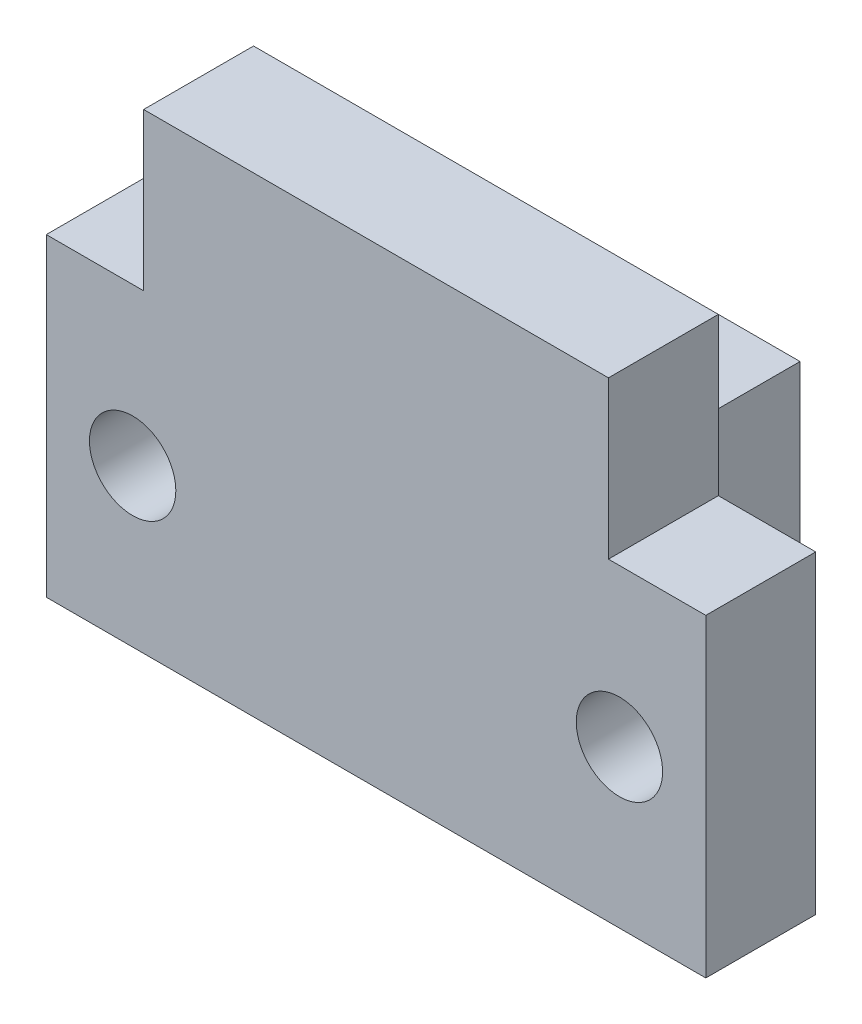
ISO-10303-21;
HEADER;
FILE_DESCRIPTION(('STEP AP214'),'2;1');
FILE_NAME('part.step','',(''),(''),'','','');
FILE_SCHEMA(('AUTOMOTIVE_DESIGN { 1 0 10303 214 1 1 1 1 }'));
ENDSEC;
DATA;
#1=APPLICATION_CONTEXT('core data for automotive mechanical design processes');
#2=APPLICATION_PROTOCOL_DEFINITION('international standard','automotive_design',2000,#1);
#3=PRODUCT_CONTEXT('',#1,'mechanical');
#4=PRODUCT('Part','Part','',(#3));
#5=PRODUCT_RELATED_PRODUCT_CATEGORY('part','',(#4));
#6=PRODUCT_DEFINITION_FORMATION('','',#4);
#7=PRODUCT_DEFINITION_CONTEXT('part definition',#1,'design');
#8=PRODUCT_DEFINITION('design','',#6,#7);
#9=PRODUCT_DEFINITION_SHAPE('','',#8);
#10=(LENGTH_UNIT() NAMED_UNIT(*) SI_UNIT(.MILLI.,.METRE.));
#11=(NAMED_UNIT(*) PLANE_ANGLE_UNIT() SI_UNIT($,.RADIAN.));
#12=(NAMED_UNIT(*) SI_UNIT($,.STERADIAN.) SOLID_ANGLE_UNIT());
#13=UNCERTAINTY_MEASURE_WITH_UNIT(LENGTH_MEASURE(1.E-05),#10,'distance_accuracy_value','');
#14=(GEOMETRIC_REPRESENTATION_CONTEXT(3) GLOBAL_UNCERTAINTY_ASSIGNED_CONTEXT((#13)) GLOBAL_UNIT_ASSIGNED_CONTEXT((#10,
#11,#12)) REPRESENTATION_CONTEXT('',''));
#15=CARTESIAN_POINT('',(0.,0.,0.));
#16=DIRECTION('',(0.,0.,1.));
#17=DIRECTION('',(1.,0.,0.));
#18=AXIS2_PLACEMENT_3D('',#15,#16,#17);
#19=CARTESIAN_POINT('',(0.,20.,0.));
#20=DIRECTION('',(0.,1.,0.));
#21=DIRECTION('',(0.,0.,1.));
#22=AXIS2_PLACEMENT_3D('',#19,#20,#21);
#23=PLANE('',#22);
#24=DIRECTION('',(-1.,0.,0.));
#25=VECTOR('',#24,1.);
#26=CARTESIAN_POINT('',(-14.8,20.,-3.5));
#27=LINE('',#26,#25);
#28=CARTESIAN_POINT('',(10.,20.,-3.5));
#29=VERTEX_POINT('',#28);
#30=CARTESIAN_POINT('',(4.,20.,-3.5));
#31=VERTEX_POINT('',#30);
#32=EDGE_CURVE('E15',#29,#31,#27,.T.);
#33=ORIENTED_EDGE('',*,*,#32,.F.);
#34=DIRECTION('',(0.,0.,-1.));
#35=VECTOR('',#34,1.);
#36=CARTESIAN_POINT('',(10.,20.,-3.49999999999999));
#37=LINE('',#36,#35);
#38=CARTESIAN_POINT('',(10.,20.,-13.5));
#39=VERTEX_POINT('',#38);
#40=EDGE_CURVE('E336',#29,#39,#37,.T.);
#41=ORIENTED_EDGE('',*,*,#40,.T.);
#42=DIRECTION('',(-1.,0.,0.));
#43=VECTOR('',#42,1.);
#44=CARTESIAN_POINT('',(10.,20.,-13.5));
#45=LINE('',#44,#43);
#46=CARTESIAN_POINT('',(4.,20.,-13.5));
#47=VERTEX_POINT('',#46);
#48=EDGE_CURVE('E333',#39,#47,#45,.T.);
#49=ORIENTED_EDGE('',*,*,#48,.T.);
#50=DIRECTION('',(0.,0.,-1.));
#51=VECTOR('',#50,1.);
#52=CARTESIAN_POINT('',(4.,20.,-3.49999999999999));
#53=LINE('',#52,#51);
#54=EDGE_CURVE('E330',#31,#47,#53,.T.);
#55=ORIENTED_EDGE('',*,*,#54,.F.);
#56=EDGE_LOOP('',(#33,#41,#49,#55));
#57=FACE_BOUND('',#56,.T.);
#58=ADVANCED_FACE('F88',(#57),#23,.T.);
#59=DIRECTION('',(-1.,0.,0.));
#60=VECTOR('',#59,1.);
#61=CARTESIAN_POINT('',(0.,20.,-3.5));
#62=LINE('',#61,#60);
#63=CARTESIAN_POINT('',(21.,20.,-3.5));
#64=VERTEX_POINT('',#63);
#65=CARTESIAN_POINT('',(14.8,20.,-3.5));
#66=VERTEX_POINT('',#65);
#67=EDGE_CURVE('E113',#64,#66,#62,.T.);
#68=ORIENTED_EDGE('',*,*,#67,.T.);
#69=DIRECTION('',(0.,0.,1.));
#70=VECTOR('',#69,1.);
#71=CARTESIAN_POINT('',(14.8,20.,-34.7435593362856));
#72=LINE('',#71,#70);
#73=CARTESIAN_POINT('',(14.8,20.,3.5));
#74=VERTEX_POINT('',#73);
#75=EDGE_CURVE('E218',#66,#74,#72,.T.);
#76=ORIENTED_EDGE('',*,*,#75,.T.);
#77=DIRECTION('',(-1.,0.,0.));
#78=VECTOR('',#77,1.);
#79=CARTESIAN_POINT('',(0.,20.,3.5));
#80=LINE('',#79,#78);
#81=CARTESIAN_POINT('',(21.,20.,3.5));
#82=VERTEX_POINT('',#81);
#83=EDGE_CURVE('E208',#82,#74,#80,.T.);
#84=ORIENTED_EDGE('',*,*,#83,.F.);
#85=DIRECTION('',(0.,0.,-1.));
#86=VECTOR('',#85,1.);
#87=CARTESIAN_POINT('',(21.,20.,0.));
#88=LINE('',#87,#86);
#89=EDGE_CURVE('E273',#82,#64,#88,.T.);
#90=ORIENTED_EDGE('',*,*,#89,.T.);
#91=EDGE_LOOP('',(#68,#76,#84,#90));
#92=FACE_BOUND('',#91,.T.);
#93=ADVANCED_FACE('F369',(#92),#23,.T.);
#94=CARTESIAN_POINT('',(-4.,20.,-3.5));
#95=VERTEX_POINT('',#94);
#96=CARTESIAN_POINT('',(-10.,20.,-3.5));
#97=VERTEX_POINT('',#96);
#98=EDGE_CURVE('E97',#95,#97,#27,.T.);
#99=ORIENTED_EDGE('',*,*,#98,.F.);
#100=DIRECTION('',(0.,0.,-1.));
#101=VECTOR('',#100,1.);
#102=CARTESIAN_POINT('',(-4.,20.,0.));
#103=LINE('',#102,#101);
#104=CARTESIAN_POINT('',(-4.,20.,-13.5));
#105=VERTEX_POINT('',#104);
#106=EDGE_CURVE('E276',#95,#105,#103,.T.);
#107=ORIENTED_EDGE('',*,*,#106,.T.);
#108=DIRECTION('',(1.,0.,0.));
#109=VECTOR('',#108,1.);
#110=CARTESIAN_POINT('',(0.,20.,-13.5));
#111=LINE('',#110,#109);
#112=CARTESIAN_POINT('',(-10.,20.,-13.5));
#113=VERTEX_POINT('',#112);
#114=EDGE_CURVE('E279',#113,#105,#111,.T.);
#115=ORIENTED_EDGE('',*,*,#114,.F.);
#116=DIRECTION('',(0.,0.,-1.));
#117=VECTOR('',#116,1.);
#118=CARTESIAN_POINT('',(-10.,20.,0.));
#119=LINE('',#118,#117);
#120=EDGE_CURVE('E282',#97,#113,#119,.T.);
#121=ORIENTED_EDGE('',*,*,#120,.F.);
#122=EDGE_LOOP('',(#99,#107,#115,#121));
#123=FACE_BOUND('',#122,.T.);
#124=ADVANCED_FACE('F358',(#123),#23,.T.);
#125=CARTESIAN_POINT('',(-15.5,10.,3.5));
#126=DIRECTION('',(0.,0.,-1.));
#127=DIRECTION('',(-1.,0.,0.));
#128=AXIS2_PLACEMENT_3D('',#125,#126,#127);
#129=CYLINDRICAL_SURFACE('',#128,2.75);
#130=CARTESIAN_POINT('',(-15.5,10.,3.5));
#131=DIRECTION('',(0.,0.,-1.));
#132=DIRECTION('',(1.,0.,0.));
#133=AXIS2_PLACEMENT_3D('',#130,#131,#132);
#134=CIRCLE('',#133,2.75);
#135=CARTESIAN_POINT('',(-12.75,10.,3.5));
#136=VERTEX_POINT('',#135);
#137=EDGE_CURVE('E267',#136,#136,#134,.T.);
#138=ORIENTED_EDGE('',*,*,#137,.F.);
#139=EDGE_LOOP('',(#138));
#140=FACE_BOUND('',#139,.T.);
#141=CARTESIAN_POINT('',(-15.5,10.,-1.5));
#142=DIRECTION('',(0.,0.,-1.));
#143=DIRECTION('',(-1.,0.,0.));
#144=AXIS2_PLACEMENT_3D('',#141,#142,#143);
#145=CIRCLE('',#144,2.75);
#146=CARTESIAN_POINT('',(-18.25,10.,-1.5));
#147=VERTEX_POINT('',#146);
#148=EDGE_CURVE('E92',#147,#147,#145,.F.);
#149=ORIENTED_EDGE('',*,*,#148,.F.);
#150=EDGE_LOOP('',(#149));
#151=FACE_BOUND('',#150,.T.);
#152=ADVANCED_FACE('F355',(#140,#151),#129,.F.);
#153=CARTESIAN_POINT('',(15.5,10.,3.5));
#154=DIRECTION('',(0.,0.,-1.));
#155=DIRECTION('',(-1.,0.,0.));
#156=AXIS2_PLACEMENT_3D('',#153,#154,#155);
#157=CYLINDRICAL_SURFACE('',#156,2.75);
#158=CARTESIAN_POINT('',(15.5,10.,3.5));
#159=DIRECTION('',(0.,0.,-1.));
#160=DIRECTION('',(-1.,0.,0.));
#161=AXIS2_PLACEMENT_3D('',#158,#159,#160);
#162=CIRCLE('',#161,2.75);
#163=CARTESIAN_POINT('',(12.75,10.,3.5));
#164=VERTEX_POINT('',#163);
#165=EDGE_CURVE('E263',#164,#164,#162,.T.);
#166=ORIENTED_EDGE('',*,*,#165,.F.);
#167=EDGE_LOOP('',(#166));
#168=FACE_BOUND('',#167,.T.);
#169=CARTESIAN_POINT('',(15.5,10.,-1.5));
#170=DIRECTION('',(0.,0.,-1.));
#171=DIRECTION('',(-1.,0.,0.));
#172=AXIS2_PLACEMENT_3D('',#169,#170,#171);
#173=CIRCLE('',#172,2.75);
#174=CARTESIAN_POINT('',(12.75,10.,-1.5));
#175=VERTEX_POINT('',#174);
#176=EDGE_CURVE('E254',#175,#175,#173,.F.);
#177=ORIENTED_EDGE('',*,*,#176,.F.);
#178=EDGE_LOOP('',(#177));
#179=FACE_BOUND('',#178,.T.);
#180=ADVANCED_FACE('F357',(#168,#179),#157,.F.);
#181=CARTESIAN_POINT('',(-21.,20.,0.));
#182=DIRECTION('',(-1.,0.,0.));
#183=DIRECTION('',(0.,0.,1.));
#184=AXIS2_PLACEMENT_3D('',#181,#182,#183);
#185=PLANE('',#184);
#186=DIRECTION('',(0.,0.,-1.));
#187=VECTOR('',#186,1.);
#188=CARTESIAN_POINT('',(-21.,0.,0.));
#189=LINE('',#188,#187);
#190=CARTESIAN_POINT('',(-21.,0.,3.5));
#191=VERTEX_POINT('',#190);
#192=CARTESIAN_POINT('',(-21.,0.,-3.5));
#193=VERTEX_POINT('',#192);
#194=EDGE_CURVE('E285',#191,#193,#189,.T.);
#195=ORIENTED_EDGE('',*,*,#194,.F.);
#196=DIRECTION('',(0.,-1.,0.));
#197=VECTOR('',#196,1.);
#198=CARTESIAN_POINT('',(-21.,20.,3.5));
#199=LINE('',#198,#197);
#200=CARTESIAN_POINT('',(-21.,20.,3.5));
#201=VERTEX_POINT('',#200);
#202=EDGE_CURVE('E324',#201,#191,#199,.T.);
#203=ORIENTED_EDGE('',*,*,#202,.F.);
#204=DIRECTION('',(0.,0.,-1.));
#205=VECTOR('',#204,1.);
#206=CARTESIAN_POINT('',(-21.,20.,0.));
#207=LINE('',#206,#205);
#208=CARTESIAN_POINT('',(-21.,20.,-3.5));
#209=VERTEX_POINT('',#208);
#210=EDGE_CURVE('E204',#201,#209,#207,.T.);
#211=ORIENTED_EDGE('',*,*,#210,.T.);
#212=DIRECTION('',(0.,-1.,0.));
#213=VECTOR('',#212,1.);
#214=CARTESIAN_POINT('',(-21.,20.,-3.5));
#215=LINE('',#214,#213);
#216=EDGE_CURVE('E307',#209,#193,#215,.T.);
#217=ORIENTED_EDGE('',*,*,#216,.T.);
#218=EDGE_LOOP('',(#195,#203,#211,#217));
#219=FACE_BOUND('',#218,.T.);
#220=ADVANCED_FACE('F365',(#219),#185,.T.);
#221=CARTESIAN_POINT('',(0.,20.,3.5));
#222=DIRECTION('',(0.,0.,1.));
#223=DIRECTION('',(1.,0.,0.));
#224=AXIS2_PLACEMENT_3D('',#221,#222,#223);
#225=PLANE('',#224);
#226=ORIENTED_EDGE('',*,*,#165,.T.);
#227=EDGE_LOOP('',(#226));
#228=FACE_BOUND('',#227,.T.);
#229=ORIENTED_EDGE('',*,*,#137,.T.);
#230=EDGE_LOOP('',(#229));
#231=FACE_BOUND('',#230,.T.);
#232=DIRECTION('',(-1.,0.,0.));
#233=VECTOR('',#232,1.);
#234=CARTESIAN_POINT('',(0.,0.,3.5));
#235=LINE('',#234,#233);
#236=CARTESIAN_POINT('',(21.,0.,3.5));
#237=VERTEX_POINT('',#236);
#238=EDGE_CURVE('E288',#237,#191,#235,.T.);
#239=ORIENTED_EDGE('',*,*,#238,.F.);
#240=DIRECTION('',(0.,-1.,0.));
#241=VECTOR('',#240,1.);
#242=CARTESIAN_POINT('',(21.,20.,3.5));
#243=LINE('',#242,#241);
#244=EDGE_CURVE('E322',#82,#237,#243,.T.);
#245=ORIENTED_EDGE('',*,*,#244,.F.);
#246=ORIENTED_EDGE('',*,*,#83,.T.);
#247=DIRECTION('',(0.,1.,0.));
#248=VECTOR('',#247,1.);
#249=CARTESIAN_POINT('',(14.8,30.,3.5));
#250=LINE('',#249,#248);
#251=CARTESIAN_POINT('',(14.8,30.,3.5));
#252=VERTEX_POINT('',#251);
#253=EDGE_CURVE('E225',#74,#252,#250,.T.);
#254=ORIENTED_EDGE('',*,*,#253,.T.);
#255=DIRECTION('',(-1.,0.,0.));
#256=VECTOR('',#255,1.);
#257=CARTESIAN_POINT('',(-14.8,30.,3.5));
#258=LINE('',#257,#256);
#259=CARTESIAN_POINT('',(-14.8,30.,3.5));
#260=VERTEX_POINT('',#259);
#261=EDGE_CURVE('E219',#252,#260,#258,.T.);
#262=ORIENTED_EDGE('',*,*,#261,.T.);
#263=DIRECTION('',(0.,-1.,0.));
#264=VECTOR('',#263,1.);
#265=CARTESIAN_POINT('',(-14.8,30.,3.5));
#266=LINE('',#265,#264);
#267=CARTESIAN_POINT('',(-14.8,20.,3.5));
#268=VERTEX_POINT('',#267);
#269=EDGE_CURVE('E215',#260,#268,#266,.T.);
#270=ORIENTED_EDGE('',*,*,#269,.T.);
#271=EDGE_CURVE('E201',#268,#201,#80,.T.);
#272=ORIENTED_EDGE('',*,*,#271,.T.);
#273=ORIENTED_EDGE('',*,*,#202,.T.);
#274=EDGE_LOOP('',(#239,#245,#246,#254,#262,#270,#272,#273));
#275=FACE_BOUND('',#274,.T.);
#276=ADVANCED_FACE('F222',(#228,#231,#275),#225,.T.);
#277=CARTESIAN_POINT('',(21.,20.,0.));
#278=DIRECTION('',(-1.,0.,0.));
#279=DIRECTION('',(0.,0.,1.));
#280=AXIS2_PLACEMENT_3D('',#277,#278,#279);
#281=PLANE('',#280);
#282=DIRECTION('',(0.,0.,-1.));
#283=VECTOR('',#282,1.);
#284=CARTESIAN_POINT('',(21.,0.,0.));
#285=LINE('',#284,#283);
#286=CARTESIAN_POINT('',(21.,0.,-3.5));
#287=VERTEX_POINT('',#286);
#288=EDGE_CURVE('E292',#237,#287,#285,.T.);
#289=ORIENTED_EDGE('',*,*,#288,.T.);
#290=DIRECTION('',(0.,-1.,0.));
#291=VECTOR('',#290,1.);
#292=CARTESIAN_POINT('',(21.,20.,-3.5));
#293=LINE('',#292,#291);
#294=EDGE_CURVE('E319',#64,#287,#293,.T.);
#295=ORIENTED_EDGE('',*,*,#294,.F.);
#296=ORIENTED_EDGE('',*,*,#89,.F.);
#297=ORIENTED_EDGE('',*,*,#244,.T.);
#298=EDGE_LOOP('',(#289,#295,#296,#297));
#299=FACE_BOUND('',#298,.T.);
#300=ADVANCED_FACE('F406',(#299),#281,.F.);
#301=CARTESIAN_POINT('',(-4.,20.,0.));
#302=DIRECTION('',(-1.,0.,0.));
#303=DIRECTION('',(0.,0.,1.));
#304=AXIS2_PLACEMENT_3D('',#301,#302,#303);
#305=PLANE('',#304);
#306=CARTESIAN_POINT('',(-4.,10.,-9.49999999999999));
#307=DIRECTION('',(-1.,0.,0.));
#308=DIRECTION('',(0.,0.,1.));
#309=AXIS2_PLACEMENT_3D('',#306,#307,#308);
#310=CIRCLE('',#309,1.75);
#311=CARTESIAN_POINT('',(-4.,10.,-7.74999999999999));
#312=VERTEX_POINT('',#311);
#313=EDGE_CURVE('E241',#312,#312,#310,.F.);
#314=ORIENTED_EDGE('',*,*,#313,.F.);
#315=EDGE_LOOP('',(#314));
#316=FACE_BOUND('',#315,.T.);
#317=DIRECTION('',(0.,0.,-1.));
#318=VECTOR('',#317,1.);
#319=CARTESIAN_POINT('',(-4.,0.,0.));
#320=LINE('',#319,#318);
#321=CARTESIAN_POINT('',(-4.,0.,-3.5));
#322=VERTEX_POINT('',#321);
#323=CARTESIAN_POINT('',(-4.,0.,-13.5));
#324=VERTEX_POINT('',#323);
#325=EDGE_CURVE('E298',#322,#324,#320,.T.);
#326=ORIENTED_EDGE('',*,*,#325,.T.);
#327=DIRECTION('',(0.,-1.,0.));
#328=VECTOR('',#327,1.);
#329=CARTESIAN_POINT('',(-4.,20.,-13.5));
#330=LINE('',#329,#328);
#331=EDGE_CURVE('E313',#105,#324,#330,.T.);
#332=ORIENTED_EDGE('',*,*,#331,.F.);
#333=ORIENTED_EDGE('',*,*,#106,.F.);
#334=DIRECTION('',(0.,-1.,0.));
#335=VECTOR('',#334,1.);
#336=CARTESIAN_POINT('',(-4.,20.,-3.5));
#337=LINE('',#336,#335);
#338=EDGE_CURVE('E315',#95,#322,#337,.T.);
#339=ORIENTED_EDGE('',*,*,#338,.T.);
#340=EDGE_LOOP('',(#326,#332,#333,#339));
#341=FACE_BOUND('',#340,.T.);
#342=ADVANCED_FACE('F402',(#316,#341),#305,.F.);
#343=CARTESIAN_POINT('',(0.,20.,-13.5));
#344=DIRECTION('',(0.,0.,-1.));
#345=DIRECTION('',(-1.,0.,0.));
#346=AXIS2_PLACEMENT_3D('',#343,#344,#345);
#347=PLANE('',#346);
#348=DIRECTION('',(1.,0.,0.));
#349=VECTOR('',#348,1.);
#350=CARTESIAN_POINT('',(0.,0.,-13.5));
#351=LINE('',#350,#349);
#352=CARTESIAN_POINT('',(-10.,0.,-13.5));
#353=VERTEX_POINT('',#352);
#354=EDGE_CURVE('E301',#353,#324,#351,.T.);
#355=ORIENTED_EDGE('',*,*,#354,.F.);
#356=DIRECTION('',(0.,-1.,0.));
#357=VECTOR('',#356,1.);
#358=CARTESIAN_POINT('',(-10.,20.,-13.5));
#359=LINE('',#358,#357);
#360=EDGE_CURVE('E311',#113,#353,#359,.T.);
#361=ORIENTED_EDGE('',*,*,#360,.F.);
#362=ORIENTED_EDGE('',*,*,#114,.T.);
#363=ORIENTED_EDGE('',*,*,#331,.T.);
#364=EDGE_LOOP('',(#355,#361,#362,#363));
#365=FACE_BOUND('',#364,.T.);
#366=ADVANCED_FACE('F394',(#365),#347,.T.);
#367=CARTESIAN_POINT('',(-10.,20.,0.));
#368=DIRECTION('',(-1.,0.,0.));
#369=DIRECTION('',(0.,0.,1.));
#370=AXIS2_PLACEMENT_3D('',#367,#368,#369);
#371=PLANE('',#370);
#372=CARTESIAN_POINT('',(-10.,10.,-9.49999999999999));
#373=DIRECTION('',(-1.,0.,0.));
#374=DIRECTION('',(0.,0.,1.));
#375=AXIS2_PLACEMENT_3D('',#372,#373,#374);
#376=CIRCLE('',#375,1.75);
#377=CARTESIAN_POINT('',(-10.,10.,-7.74999999999999));
#378=VERTEX_POINT('',#377);
#379=EDGE_CURVE('E238',#378,#378,#376,.T.);
#380=ORIENTED_EDGE('',*,*,#379,.F.);
#381=EDGE_LOOP('',(#380));
#382=FACE_BOUND('',#381,.T.);
#383=DIRECTION('',(0.,0.,-1.));
#384=VECTOR('',#383,1.);
#385=CARTESIAN_POINT('',(-10.,0.,0.));
#386=LINE('',#385,#384);
#387=CARTESIAN_POINT('',(-10.,0.,-3.5));
#388=VERTEX_POINT('',#387);
#389=EDGE_CURVE('E304',#388,#353,#386,.T.);
#390=ORIENTED_EDGE('',*,*,#389,.F.);
#391=DIRECTION('',(0.,-1.,0.));
#392=VECTOR('',#391,1.);
#393=CARTESIAN_POINT('',(-10.,20.,-3.5));
#394=LINE('',#393,#392);
#395=EDGE_CURVE('E309',#97,#388,#394,.T.);
#396=ORIENTED_EDGE('',*,*,#395,.F.);
#397=ORIENTED_EDGE('',*,*,#120,.T.);
#398=ORIENTED_EDGE('',*,*,#360,.T.);
#399=EDGE_LOOP('',(#390,#396,#397,#398));
#400=FACE_BOUND('',#399,.T.);
#401=ADVANCED_FACE('F388',(#382,#400),#371,.T.);
#402=CARTESIAN_POINT('',(0.,20.,-3.5));
#403=DIRECTION('',(0.,0.,1.));
#404=DIRECTION('',(1.,0.,0.));
#405=AXIS2_PLACEMENT_3D('',#402,#403,#404);
#406=PLANE('',#405);
#407=CARTESIAN_POINT('',(-15.5,10.,-3.5));
#408=DIRECTION('',(0.,0.,-1.));
#409=DIRECTION('',(-1.,0.,0.));
#410=AXIS2_PLACEMENT_3D('',#407,#408,#409);
#411=CIRCLE('',#410,4.5);
#412=CARTESIAN_POINT('',(-20.,10.,-3.5));
#413=VERTEX_POINT('',#412);
#414=EDGE_CURVE('E248',#413,#413,#411,.T.);
#415=ORIENTED_EDGE('',*,*,#414,.F.);
#416=EDGE_LOOP('',(#415));
#417=FACE_BOUND('',#416,.T.);
#418=DIRECTION('',(-1.,0.,0.));
#419=VECTOR('',#418,1.);
#420=CARTESIAN_POINT('',(0.,0.,-3.5));
#421=LINE('',#420,#419);
#422=EDGE_CURVE('E270',#388,#193,#421,.T.);
#423=ORIENTED_EDGE('',*,*,#422,.T.);
#424=ORIENTED_EDGE('',*,*,#216,.F.);
#425=CARTESIAN_POINT('',(-14.8,20.,-3.5));
#426=VERTEX_POINT('',#425);
#427=EDGE_CURVE('E277',#426,#209,#62,.T.);
#428=ORIENTED_EDGE('',*,*,#427,.F.);
#429=DIRECTION('',(0.,1.,0.));
#430=VECTOR('',#429,1.);
#431=CARTESIAN_POINT('',(-14.8,30.,-3.5));
#432=LINE('',#431,#430);
#433=CARTESIAN_POINT('',(-14.8,30.,-3.5));
#434=VERTEX_POINT('',#433);
#435=EDGE_CURVE('E217',#426,#434,#432,.T.);
#436=ORIENTED_EDGE('',*,*,#435,.T.);
#437=DIRECTION('',(1.,0.,0.));
#438=VECTOR('',#437,1.);
#439=CARTESIAN_POINT('',(-14.8,30.,-3.5));
#440=LINE('',#439,#438);
#441=CARTESIAN_POINT('',(14.8,30.,-3.5));
#442=VERTEX_POINT('',#441);
#443=EDGE_CURVE('E459',#434,#442,#440,.T.);
#444=ORIENTED_EDGE('',*,*,#443,.T.);
#445=DIRECTION('',(0.,-1.,0.));
#446=VECTOR('',#445,1.);
#447=CARTESIAN_POINT('',(14.8,30.,-3.5));
#448=LINE('',#447,#446);
#449=EDGE_CURVE('E234',#442,#66,#448,.T.);
#450=ORIENTED_EDGE('',*,*,#449,.T.);
#451=ORIENTED_EDGE('',*,*,#67,.F.);
#452=ORIENTED_EDGE('',*,*,#294,.T.);
#453=CARTESIAN_POINT('',(10.,0.,-3.5));
#454=VERTEX_POINT('',#453);
#455=EDGE_CURVE('E295',#287,#454,#421,.T.);
#456=ORIENTED_EDGE('',*,*,#455,.T.);
#457=DIRECTION('',(0.,-1.,0.));
#458=VECTOR('',#457,1.);
#459=CARTESIAN_POINT('',(10.,20.,-3.5));
#460=LINE('',#459,#458);
#461=EDGE_CURVE('E328',#29,#454,#460,.T.);
#462=ORIENTED_EDGE('',*,*,#461,.F.);
#463=ORIENTED_EDGE('',*,*,#32,.T.);
#464=DIRECTION('',(0.,-1.,0.));
#465=VECTOR('',#464,1.);
#466=CARTESIAN_POINT('',(4.,20.,-3.5));
#467=LINE('',#466,#465);
#468=CARTESIAN_POINT('',(4.,0.,-3.5));
#469=VERTEX_POINT('',#468);
#470=EDGE_CURVE('E326',#31,#469,#467,.T.);
#471=ORIENTED_EDGE('',*,*,#470,.T.);
#472=EDGE_CURVE('E294',#469,#322,#421,.T.);
#473=ORIENTED_EDGE('',*,*,#472,.T.);
#474=ORIENTED_EDGE('',*,*,#338,.F.);
#475=ORIENTED_EDGE('',*,*,#98,.T.);
#476=ORIENTED_EDGE('',*,*,#395,.T.);
#477=EDGE_LOOP('',(#423,#424,#428,#436,#444,#450,#451,#452,#456,#462,#463,#471,#473,#474,#475,#476));
#478=FACE_BOUND('',#477,.T.);
#479=CARTESIAN_POINT('',(15.5,10.,-3.5));
#480=DIRECTION('',(0.,0.,-1.));
#481=DIRECTION('',(-1.,0.,0.));
#482=AXIS2_PLACEMENT_3D('',#479,#480,#481);
#483=CIRCLE('',#482,4.5);
#484=CARTESIAN_POINT('',(11.,10.,-3.5));
#485=VERTEX_POINT('',#484);
#486=EDGE_CURVE('E255',#485,#485,#483,.T.);
#487=ORIENTED_EDGE('',*,*,#486,.F.);
#488=EDGE_LOOP('',(#487));
#489=FACE_BOUND('',#488,.T.);
#490=ADVANCED_FACE('F381',(#417,#478,#489),#406,.F.);
#491=DIRECTION('',(0.,0.,1.));
#492=VECTOR('',#491,1.);
#493=CARTESIAN_POINT('',(-14.8,20.,-34.7435593362856));
#494=LINE('',#493,#492);
#495=EDGE_CURVE('E105',#426,#268,#494,.T.);
#496=ORIENTED_EDGE('',*,*,#495,.F.);
#497=ORIENTED_EDGE('',*,*,#427,.T.);
#498=ORIENTED_EDGE('',*,*,#210,.F.);
#499=ORIENTED_EDGE('',*,*,#271,.F.);
#500=EDGE_LOOP('',(#496,#497,#498,#499));
#501=FACE_BOUND('',#500,.T.);
#502=ADVANCED_FACE('F202',(#501),#23,.T.);
#503=CARTESIAN_POINT('',(0.,0.,0.));
#504=DIRECTION('',(0.,1.,0.));
#505=DIRECTION('',(0.,0.,1.));
#506=AXIS2_PLACEMENT_3D('',#503,#504,#505);
#507=PLANE('',#506);
#508=ORIENTED_EDGE('',*,*,#194,.T.);
#509=ORIENTED_EDGE('',*,*,#422,.F.);
#510=ORIENTED_EDGE('',*,*,#389,.T.);
#511=ORIENTED_EDGE('',*,*,#354,.T.);
#512=ORIENTED_EDGE('',*,*,#325,.F.);
#513=ORIENTED_EDGE('',*,*,#472,.F.);
#514=DIRECTION('',(0.,0.,-1.));
#515=VECTOR('',#514,1.);
#516=CARTESIAN_POINT('',(4.,0.,-3.49999999999999));
#517=LINE('',#516,#515);
#518=CARTESIAN_POINT('',(4.,0.,-13.5));
#519=VERTEX_POINT('',#518);
#520=EDGE_CURVE('E266',#469,#519,#517,.T.);
#521=ORIENTED_EDGE('',*,*,#520,.T.);
#522=DIRECTION('',(-1.,0.,0.));
#523=VECTOR('',#522,1.);
#524=CARTESIAN_POINT('',(10.,0.,-13.5));
#525=LINE('',#524,#523);
#526=CARTESIAN_POINT('',(10.,0.,-13.5));
#527=VERTEX_POINT('',#526);
#528=EDGE_CURVE('E341',#527,#519,#525,.T.);
#529=ORIENTED_EDGE('',*,*,#528,.F.);
#530=DIRECTION('',(0.,0.,-1.));
#531=VECTOR('',#530,1.);
#532=CARTESIAN_POINT('',(10.,0.,-3.49999999999999));
#533=LINE('',#532,#531);
#534=EDGE_CURVE('E334',#454,#527,#533,.T.);
#535=ORIENTED_EDGE('',*,*,#534,.F.);
#536=ORIENTED_EDGE('',*,*,#455,.F.);
#537=ORIENTED_EDGE('',*,*,#288,.F.);
#538=ORIENTED_EDGE('',*,*,#238,.T.);
#539=EDGE_LOOP('',(#508,#509,#510,#511,#512,#513,#521,#529,#535,#536,#537,#538));
#540=FACE_BOUND('',#539,.T.);
#541=ADVANCED_FACE('F380',(#540),#507,.F.);
#542=CARTESIAN_POINT('',(10.,20.,-3.49999999999999));
#543=DIRECTION('',(-1.,0.,0.));
#544=DIRECTION('',(0.,0.,1.));
#545=AXIS2_PLACEMENT_3D('',#542,#543,#544);
#546=PLANE('',#545);
#547=CARTESIAN_POINT('',(10.,10.,-9.49999999999999));
#548=DIRECTION('',(1.,0.,0.));
#549=DIRECTION('',(0.,0.,-1.));
#550=AXIS2_PLACEMENT_3D('',#547,#548,#549);
#551=CIRCLE('',#550,1.75);
#552=CARTESIAN_POINT('',(10.,10.,-11.25));
#553=VERTEX_POINT('',#552);
#554=EDGE_CURVE('E245',#553,#553,#551,.T.);
#555=ORIENTED_EDGE('',*,*,#554,.F.);
#556=EDGE_LOOP('',(#555));
#557=FACE_BOUND('',#556,.T.);
#558=ORIENTED_EDGE('',*,*,#534,.T.);
#559=DIRECTION('',(0.,-1.,0.));
#560=VECTOR('',#559,1.);
#561=CARTESIAN_POINT('',(10.,20.,-13.5));
#562=LINE('',#561,#560);
#563=EDGE_CURVE('E289',#39,#527,#562,.T.);
#564=ORIENTED_EDGE('',*,*,#563,.F.);
#565=ORIENTED_EDGE('',*,*,#40,.F.);
#566=ORIENTED_EDGE('',*,*,#461,.T.);
#567=EDGE_LOOP('',(#558,#564,#565,#566));
#568=FACE_BOUND('',#567,.T.);
#569=ADVANCED_FACE('F368',(#557,#568),#546,.F.);
#570=CARTESIAN_POINT('',(10.,20.,-13.5));
#571=DIRECTION('',(0.,0.,1.));
#572=DIRECTION('',(1.,0.,0.));
#573=AXIS2_PLACEMENT_3D('',#570,#571,#572);
#574=PLANE('',#573);
#575=ORIENTED_EDGE('',*,*,#528,.T.);
#576=DIRECTION('',(0.,-1.,0.));
#577=VECTOR('',#576,1.);
#578=CARTESIAN_POINT('',(4.,20.,-13.5));
#579=LINE('',#578,#577);
#580=EDGE_CURVE('E338',#47,#519,#579,.T.);
#581=ORIENTED_EDGE('',*,*,#580,.F.);
#582=ORIENTED_EDGE('',*,*,#48,.F.);
#583=ORIENTED_EDGE('',*,*,#563,.T.);
#584=EDGE_LOOP('',(#575,#581,#582,#583));
#585=FACE_BOUND('',#584,.T.);
#586=ADVANCED_FACE('F418',(#585),#574,.F.);
#587=CARTESIAN_POINT('',(4.,20.,-3.49999999999999));
#588=DIRECTION('',(-1.,0.,0.));
#589=DIRECTION('',(0.,0.,1.));
#590=AXIS2_PLACEMENT_3D('',#587,#588,#589);
#591=PLANE('',#590);
#592=CARTESIAN_POINT('',(4.,10.,-9.49999999999999));
#593=DIRECTION('',(-1.,0.,0.));
#594=DIRECTION('',(0.,0.,1.));
#595=AXIS2_PLACEMENT_3D('',#592,#593,#594);
#596=CIRCLE('',#595,1.75);
#597=CARTESIAN_POINT('',(4.,10.,-7.74999999999999));
#598=VERTEX_POINT('',#597);
#599=EDGE_CURVE('E244',#598,#598,#596,.F.);
#600=ORIENTED_EDGE('',*,*,#599,.T.);
#601=EDGE_LOOP('',(#600));
#602=FACE_BOUND('',#601,.T.);
#603=ORIENTED_EDGE('',*,*,#520,.F.);
#604=ORIENTED_EDGE('',*,*,#470,.F.);
#605=ORIENTED_EDGE('',*,*,#54,.T.);
#606=ORIENTED_EDGE('',*,*,#580,.T.);
#607=EDGE_LOOP('',(#603,#604,#605,#606));
#608=FACE_BOUND('',#607,.T.);
#609=ADVANCED_FACE('F90',(#602,#608),#591,.T.);
#610=CARTESIAN_POINT('',(15.5,10.,-1.5));
#611=DIRECTION('',(0.,0.,-1.));
#612=DIRECTION('',(-1.,0.,0.));
#613=AXIS2_PLACEMENT_3D('',#610,#611,#612);
#614=PLANE('',#613);
#615=CARTESIAN_POINT('',(15.5,10.,-1.5));
#616=DIRECTION('',(0.,0.,-1.));
#617=DIRECTION('',(-1.,0.,0.));
#618=AXIS2_PLACEMENT_3D('',#615,#616,#617);
#619=CIRCLE('',#618,4.5);
#620=CARTESIAN_POINT('',(11.,10.,-1.5));
#621=VERTEX_POINT('',#620);
#622=EDGE_CURVE('E251',#621,#621,#619,.T.);
#623=ORIENTED_EDGE('',*,*,#622,.T.);
#624=EDGE_LOOP('',(#623));
#625=FACE_BOUND('',#624,.T.);
#626=ORIENTED_EDGE('',*,*,#176,.T.);
#627=EDGE_LOOP('',(#626));
#628=FACE_BOUND('',#627,.T.);
#629=ADVANCED_FACE('F387',(#625,#628),#614,.T.);
#630=CARTESIAN_POINT('',(15.5,10.,-1.5));
#631=DIRECTION('',(0.,0.,-1.));
#632=DIRECTION('',(-1.,0.,0.));
#633=AXIS2_PLACEMENT_3D('',#630,#631,#632);
#634=CYLINDRICAL_SURFACE('',#633,4.5);
#635=ORIENTED_EDGE('',*,*,#622,.F.);
#636=EDGE_LOOP('',(#635));
#637=FACE_BOUND('',#636,.T.);
#638=ORIENTED_EDGE('',*,*,#486,.T.);
#639=EDGE_LOOP('',(#638));
#640=FACE_BOUND('',#639,.T.);
#641=ADVANCED_FACE('F490',(#637,#640),#634,.F.);
#642=CARTESIAN_POINT('',(-15.5,10.,-1.5));
#643=DIRECTION('',(0.,0.,-1.));
#644=DIRECTION('',(-1.,0.,0.));
#645=AXIS2_PLACEMENT_3D('',#642,#643,#644);
#646=PLANE('',#645);
#647=CARTESIAN_POINT('',(-15.5,10.,-1.5));
#648=DIRECTION('',(0.,0.,-1.));
#649=DIRECTION('',(-1.,0.,0.));
#650=AXIS2_PLACEMENT_3D('',#647,#648,#649);
#651=CIRCLE('',#650,4.5);
#652=CARTESIAN_POINT('',(-20.,10.,-1.5));
#653=VERTEX_POINT('',#652);
#654=EDGE_CURVE('E258',#653,#653,#651,.T.);
#655=ORIENTED_EDGE('',*,*,#654,.T.);
#656=EDGE_LOOP('',(#655));
#657=FACE_BOUND('',#656,.T.);
#658=ORIENTED_EDGE('',*,*,#148,.T.);
#659=EDGE_LOOP('',(#658));
#660=FACE_BOUND('',#659,.T.);
#661=ADVANCED_FACE('F353',(#657,#660),#646,.T.);
#662=CARTESIAN_POINT('',(-15.5,10.,-1.5));
#663=DIRECTION('',(0.,0.,-1.));
#664=DIRECTION('',(-1.,0.,0.));
#665=AXIS2_PLACEMENT_3D('',#662,#663,#664);
#666=CYLINDRICAL_SURFACE('',#665,4.5);
#667=ORIENTED_EDGE('',*,*,#654,.F.);
#668=EDGE_LOOP('',(#667));
#669=FACE_BOUND('',#668,.T.);
#670=ORIENTED_EDGE('',*,*,#414,.T.);
#671=EDGE_LOOP('',(#670));
#672=FACE_BOUND('',#671,.T.);
#673=ADVANCED_FACE('F486',(#669,#672),#666,.F.);
#674=CARTESIAN_POINT('',(-21.001,10.,-9.49999999999999));
#675=DIRECTION('',(1.,0.,0.));
#676=DIRECTION('',(0.,0.,-1.));
#677=AXIS2_PLACEMENT_3D('',#674,#675,#676);
#678=CYLINDRICAL_SURFACE('',#677,1.75);
#679=ORIENTED_EDGE('',*,*,#599,.F.);
#680=EDGE_LOOP('',(#679));
#681=FACE_BOUND('',#680,.T.);
#682=ORIENTED_EDGE('',*,*,#554,.T.);
#683=EDGE_LOOP('',(#682));
#684=FACE_BOUND('',#683,.T.);
#685=ADVANCED_FACE('F482',(#681,#684),#678,.F.);
#686=CARTESIAN_POINT('',(21.001,10.,-9.49999999999999));
#687=DIRECTION('',(-1.,0.,0.));
#688=DIRECTION('',(0.,0.,1.));
#689=AXIS2_PLACEMENT_3D('',#686,#687,#688);
#690=CYLINDRICAL_SURFACE('',#689,1.75);
#691=ORIENTED_EDGE('',*,*,#379,.T.);
#692=EDGE_LOOP('',(#691));
#693=FACE_BOUND('',#692,.T.);
#694=ORIENTED_EDGE('',*,*,#313,.T.);
#695=EDGE_LOOP('',(#694));
#696=FACE_BOUND('',#695,.T.);
#697=ADVANCED_FACE('F479',(#693,#696),#690,.F.);
#698=CARTESIAN_POINT('',(-14.8,30.,-34.7435593362856));
#699=DIRECTION('',(-1.,0.,0.));
#700=DIRECTION('',(0.,-1.,0.));
#701=AXIS2_PLACEMENT_3D('',#698,#699,#700);
#702=PLANE('',#701);
#703=ORIENTED_EDGE('',*,*,#435,.F.);
#704=ORIENTED_EDGE('',*,*,#495,.T.);
#705=ORIENTED_EDGE('',*,*,#269,.F.);
#706=DIRECTION('',(0.,0.,1.));
#707=VECTOR('',#706,1.);
#708=CARTESIAN_POINT('',(-14.8,30.,-34.7435593362856));
#709=LINE('',#708,#707);
#710=EDGE_CURVE('E232',#434,#260,#709,.T.);
#711=ORIENTED_EDGE('',*,*,#710,.F.);
#712=EDGE_LOOP('',(#703,#704,#705,#711));
#713=FACE_BOUND('',#712,.T.);
#714=ADVANCED_FACE('F213',(#713),#702,.T.);
#715=CARTESIAN_POINT('',(-14.8,30.,-34.7435593362856));
#716=DIRECTION('',(0.,1.,0.));
#717=DIRECTION('',(-1.,0.,0.));
#718=AXIS2_PLACEMENT_3D('',#715,#716,#717);
#719=PLANE('',#718);
#720=ORIENTED_EDGE('',*,*,#443,.F.);
#721=ORIENTED_EDGE('',*,*,#710,.T.);
#722=ORIENTED_EDGE('',*,*,#261,.F.);
#723=DIRECTION('',(0.,0.,1.));
#724=VECTOR('',#723,1.);
#725=CARTESIAN_POINT('',(14.8,30.,-34.7435593362856));
#726=LINE('',#725,#724);
#727=EDGE_CURVE('E235',#442,#252,#726,.T.);
#728=ORIENTED_EDGE('',*,*,#727,.F.);
#729=EDGE_LOOP('',(#720,#721,#722,#728));
#730=FACE_BOUND('',#729,.T.);
#731=ADVANCED_FACE('F463',(#730),#719,.T.);
#732=CARTESIAN_POINT('',(14.8,30.,-34.7435593362856));
#733=DIRECTION('',(1.,0.,0.));
#734=DIRECTION('',(0.,1.,0.));
#735=AXIS2_PLACEMENT_3D('',#732,#733,#734);
#736=PLANE('',#735);
#737=ORIENTED_EDGE('',*,*,#449,.F.);
#738=ORIENTED_EDGE('',*,*,#727,.T.);
#739=ORIENTED_EDGE('',*,*,#253,.F.);
#740=ORIENTED_EDGE('',*,*,#75,.F.);
#741=EDGE_LOOP('',(#737,#738,#739,#740));
#742=FACE_BOUND('',#741,.T.);
#743=ADVANCED_FACE('F468',(#742),#736,.T.);
#744=CLOSED_SHELL('',(#58,#93,#124,#152,#180,#220,#276,#300,#342,#366,#401,#490,#502,#541,#569,
#586,#609,#629,#641,#661,#673,#685,#697,#714,#731,#743));
#745=MANIFOLD_SOLID_BREP('B2_NOT_SHOWN',#744);
#746=CARTESIAN_POINT('',(-11.0710678118655,10.,-9.49999999999999));
#747=DIRECTION('',(1.,0.,0.));
#748=DIRECTION('',(0.,0.,-1.));
#749=AXIS2_PLACEMENT_3D('',#746,#747,#748);
#750=CYLINDRICAL_SURFACE('',#749,2.5);
#751=CARTESIAN_POINT('',(4.,10.,-9.49999999999999));
#752=DIRECTION('',(-1.,0.,0.));
#753=DIRECTION('',(0.,0.,1.));
#754=AXIS2_PLACEMENT_3D('',#751,#752,#753);
#755=CIRCLE('',#754,2.5);
#756=CARTESIAN_POINT('',(4.,10.,-12.));
#757=VERTEX_POINT('',#756);
#758=EDGE_CURVE('E706',#757,#757,#755,.T.);
#759=CARTESIAN_POINT('',(-3.6,10.,-9.49999999999999));
#760=DIRECTION('',(-1.,0.,0.));
#761=DIRECTION('',(0.,0.,1.));
#762=AXIS2_PLACEMENT_3D('',#759,#760,#761);
#763=CIRCLE('',#762,2.5);
#764=CARTESIAN_POINT('',(-3.6,10.,-12.));
#765=VERTEX_POINT('',#764);
#766=EDGE_CURVE('E87',#765,#765,#763,.T.);
#767=CARTESIAN_POINT('',(4.,10.,-12.));
#768=CARTESIAN_POINT('',(3.92083333333333,10.,-12.));
#769=CARTESIAN_POINT('',(3.84166666666667,10.,-12.));
#770=CARTESIAN_POINT('',(3.68333333333333,10.,-12.));
#771=CARTESIAN_POINT('',(3.60416666666667,10.,-12.));
#772=CARTESIAN_POINT('',(3.44583333333333,10.,-12.));
#773=CARTESIAN_POINT('',(3.36666666666667,10.,-12.));
#774=CARTESIAN_POINT('',(3.20833333333333,10.,-12.));
#775=CARTESIAN_POINT('',(3.12916666666667,10.,-12.));
#776=CARTESIAN_POINT('',(2.97083333333333,10.,-12.));
#777=CARTESIAN_POINT('',(2.89166666666667,10.,-12.));
#778=CARTESIAN_POINT('',(2.73333333333333,10.,-12.));
#779=CARTESIAN_POINT('',(2.65416666666667,10.,-12.));
#780=CARTESIAN_POINT('',(2.49583333333333,10.,-12.));
#781=CARTESIAN_POINT('',(2.41666666666666,10.,-12.));
#782=CARTESIAN_POINT('',(2.25833333333333,10.,-12.));
#783=CARTESIAN_POINT('',(2.17916666666667,10.,-12.));
#784=CARTESIAN_POINT('',(2.02083333333333,10.,-12.));
#785=CARTESIAN_POINT('',(1.94166666666667,10.,-12.));
#786=CARTESIAN_POINT('',(1.78333333333333,10.,-12.));
#787=CARTESIAN_POINT('',(1.70416666666667,10.,-12.));
#788=CARTESIAN_POINT('',(1.54583333333333,10.,-12.));
#789=CARTESIAN_POINT('',(1.46666666666667,10.,-12.));
#790=CARTESIAN_POINT('',(1.30833333333333,10.,-12.));
#791=CARTESIAN_POINT('',(1.22916666666666,10.,-12.));
#792=CARTESIAN_POINT('',(1.07083333333333,10.,-12.));
#793=CARTESIAN_POINT('',(0.991666666666665,10.,-12.));
#794=CARTESIAN_POINT('',(0.833333333333332,10.,-12.));
#795=CARTESIAN_POINT('',(0.754166666666665,10.,-12.));
#796=CARTESIAN_POINT('',(0.595833333333332,10.,-12.));
#797=CARTESIAN_POINT('',(0.516666666666665,10.,-12.));
#798=CARTESIAN_POINT('',(0.358333333333332,10.,-12.));
#799=CARTESIAN_POINT('',(0.279166666666665,10.,-12.));
#800=CARTESIAN_POINT('',(0.120833333333332,10.,-12.));
#801=CARTESIAN_POINT('',(0.0416666666666655,10.,-12.));
#802=CARTESIAN_POINT('',(-0.116666666666668,10.,-12.));
#803=CARTESIAN_POINT('',(-0.195833333333334,10.,-12.));
#804=CARTESIAN_POINT('',(-0.354166666666668,10.,-12.));
#805=CARTESIAN_POINT('',(-0.433333333333334,10.,-12.));
#806=CARTESIAN_POINT('',(-0.591666666666667,10.,-12.));
#807=CARTESIAN_POINT('',(-0.670833333333334,10.,-12.));
#808=CARTESIAN_POINT('',(-0.829166666666667,10.,-12.));
#809=CARTESIAN_POINT('',(-0.908333333333334,10.,-12.));
#810=CARTESIAN_POINT('',(-1.06666666666667,10.,-12.));
#811=CARTESIAN_POINT('',(-1.14583333333333,10.,-12.));
#812=CARTESIAN_POINT('',(-1.30416666666667,10.,-12.));
#813=CARTESIAN_POINT('',(-1.38333333333333,10.,-12.));
#814=CARTESIAN_POINT('',(-1.54166666666667,10.,-12.));
#815=CARTESIAN_POINT('',(-1.62083333333333,10.,-12.));
#816=CARTESIAN_POINT('',(-1.77916666666667,10.,-12.));
#817=CARTESIAN_POINT('',(-1.85833333333333,10.,-12.));
#818=CARTESIAN_POINT('',(-2.01666666666667,10.,-12.));
#819=CARTESIAN_POINT('',(-2.09583333333333,10.,-12.));
#820=CARTESIAN_POINT('',(-2.25416666666667,10.,-12.));
#821=CARTESIAN_POINT('',(-2.33333333333333,10.,-12.));
#822=CARTESIAN_POINT('',(-2.49166666666667,10.,-12.));
#823=CARTESIAN_POINT('',(-2.57083333333333,10.,-12.));
#824=CARTESIAN_POINT('',(-2.72916666666667,10.,-12.));
#825=CARTESIAN_POINT('',(-2.80833333333333,10.,-12.));
#826=CARTESIAN_POINT('',(-2.96666666666667,10.,-12.));
#827=CARTESIAN_POINT('',(-3.04583333333333,10.,-12.));
#828=CARTESIAN_POINT('',(-3.20416666666667,10.,-12.));
#829=CARTESIAN_POINT('',(-3.28333333333333,10.,-12.));
#830=CARTESIAN_POINT('',(-3.44166666666667,10.,-12.));
#831=CARTESIAN_POINT('',(-3.52083333333333,10.,-12.));
#832=CARTESIAN_POINT('',(-3.6,10.,-12.));
#833=B_SPLINE_CURVE_WITH_KNOTS('',3,(#767,#768,#769,#770,#771,#772,#773,#774,#775,#776,#777,
#778,#779,#780,#781,#782,#783,#784,#785,#786,#787,#788,#789,#790,#791,#792,#793,#794,#795,#796,
#797,#798,#799,#800,#801,#802,#803,#804,#805,#806,#807,#808,#809,#810,#811,#812,#813,#814,#815,
#816,#817,#818,#819,#820,#821,#822,#823,#824,#825,#826,#827,#828,#829,#830,#831,#832),
.UNSPECIFIED.,.F.,.F.,(4,2,2,2,2,2,2,2,2,2,2,2,2,2,2,2,2,2,2,2,2,2,2,2,2,2,2,2,2,2,2,2,4),(0.,
0.2375,0.475,0.7125,0.95,1.1875,1.425,1.6625,1.9,2.1375,2.375,2.6125,2.85,3.0875,3.325,3.5625,
3.8,4.0375,4.275,4.5125,4.75,4.9875,5.225,5.4625,5.7,5.9375,6.175,6.4125,6.65,6.8875,7.125,
7.3625,7.6),.UNSPECIFIED.);
#834=EDGE_CURVE('BSEAM699',#757,#765,#833,.T.);
#835=ORIENTED_EDGE('',*,*,#758,.T.);
#836=ORIENTED_EDGE('',*,*,#766,.F.);
#837=ORIENTED_EDGE('',*,*,#834,.T.);
#838=ORIENTED_EDGE('',*,*,#834,.F.);
#839=EDGE_LOOP('',(#835,#837,#836,#838));
#840=FACE_BOUND('',#839,.T.);
#841=ADVANCED_FACE('F699',(#840),#750,.T.);
#842=CARTESIAN_POINT('',(4.,10.,-9.49999999999999));
#843=DIRECTION('',(-1.,0.,0.));
#844=DIRECTION('',(0.,0.,1.));
#845=AXIS2_PLACEMENT_3D('',#842,#843,#844);
#846=PLANE('',#845);
#847=ORIENTED_EDGE('',*,*,#758,.F.);
#848=EDGE_LOOP('',(#847));
#849=FACE_BOUND('',#848,.T.);
#850=CARTESIAN_POINT('',(4.,10.,-9.49999999999999));
#851=DIRECTION('',(-1.,0.,0.));
#852=DIRECTION('',(0.,0.,1.));
#853=AXIS2_PLACEMENT_3D('',#850,#851,#852);
#854=CIRCLE('',#853,1.75);
#855=CARTESIAN_POINT('',(4.,10.,-11.25));
#856=VERTEX_POINT('',#855);
#857=EDGE_CURVE('E711',#856,#856,#854,.T.);
#858=ORIENTED_EDGE('',*,*,#857,.T.);
#859=EDGE_LOOP('',(#858));
#860=FACE_BOUND('',#859,.T.);
#861=ADVANCED_FACE('F727',(#849,#860),#846,.F.);
#862=CARTESIAN_POINT('',(-11.0710678118655,10.,-9.49999999999999));
#863=DIRECTION('',(1.,0.,0.));
#864=DIRECTION('',(0.,0.,-1.));
#865=AXIS2_PLACEMENT_3D('',#862,#863,#864);
#866=CYLINDRICAL_SURFACE('',#865,1.75);
#867=CARTESIAN_POINT('',(-3.6,10.,-9.49999999999999));
#868=DIRECTION('',(-1.,0.,0.));
#869=DIRECTION('',(0.,0.,1.));
#870=AXIS2_PLACEMENT_3D('',#867,#868,#869);
#871=CIRCLE('',#870,1.75);
#872=CARTESIAN_POINT('',(-3.6,10.,-11.25));
#873=VERTEX_POINT('',#872);
#874=EDGE_CURVE('E702',#873,#873,#871,.T.);
#875=CARTESIAN_POINT('',(4.,10.,-11.25));
#876=CARTESIAN_POINT('',(3.92083333333333,10.,-11.25));
#877=CARTESIAN_POINT('',(3.84166666666667,10.,-11.25));
#878=CARTESIAN_POINT('',(3.68333333333333,10.,-11.25));
#879=CARTESIAN_POINT('',(3.60416666666667,10.,-11.25));
#880=CARTESIAN_POINT('',(3.44583333333333,10.,-11.25));
#881=CARTESIAN_POINT('',(3.36666666666667,10.,-11.25));
#882=CARTESIAN_POINT('',(3.20833333333333,10.,-11.25));
#883=CARTESIAN_POINT('',(3.12916666666667,10.,-11.25));
#884=CARTESIAN_POINT('',(2.97083333333333,10.,-11.25));
#885=CARTESIAN_POINT('',(2.89166666666667,10.,-11.25));
#886=CARTESIAN_POINT('',(2.73333333333333,10.,-11.25));
#887=CARTESIAN_POINT('',(2.65416666666667,10.,-11.25));
#888=CARTESIAN_POINT('',(2.49583333333333,10.,-11.25));
#889=CARTESIAN_POINT('',(2.41666666666666,10.,-11.25));
#890=CARTESIAN_POINT('',(2.25833333333333,10.,-11.25));
#891=CARTESIAN_POINT('',(2.17916666666667,10.,-11.25));
#892=CARTESIAN_POINT('',(2.02083333333333,10.,-11.25));
#893=CARTESIAN_POINT('',(1.94166666666667,10.,-11.25));
#894=CARTESIAN_POINT('',(1.78333333333333,10.,-11.25));
#895=CARTESIAN_POINT('',(1.70416666666667,10.,-11.25));
#896=CARTESIAN_POINT('',(1.54583333333333,10.,-11.25));
#897=CARTESIAN_POINT('',(1.46666666666667,10.,-11.25));
#898=CARTESIAN_POINT('',(1.30833333333333,10.,-11.25));
#899=CARTESIAN_POINT('',(1.22916666666666,10.,-11.25));
#900=CARTESIAN_POINT('',(1.07083333333333,10.,-11.25));
#901=CARTESIAN_POINT('',(0.991666666666665,10.,-11.25));
#902=CARTESIAN_POINT('',(0.833333333333332,10.,-11.25));
#903=CARTESIAN_POINT('',(0.754166666666665,10.,-11.25));
#904=CARTESIAN_POINT('',(0.595833333333332,10.,-11.25));
#905=CARTESIAN_POINT('',(0.516666666666665,10.,-11.25));
#906=CARTESIAN_POINT('',(0.358333333333332,10.,-11.25));
#907=CARTESIAN_POINT('',(0.279166666666665,10.,-11.25));
#908=CARTESIAN_POINT('',(0.120833333333332,10.,-11.25));
#909=CARTESIAN_POINT('',(0.0416666666666655,10.,-11.25));
#910=CARTESIAN_POINT('',(-0.116666666666668,10.,-11.25));
#911=CARTESIAN_POINT('',(-0.195833333333334,10.,-11.25));
#912=CARTESIAN_POINT('',(-0.354166666666668,10.,-11.25));
#913=CARTESIAN_POINT('',(-0.433333333333334,10.,-11.25));
#914=CARTESIAN_POINT('',(-0.591666666666667,10.,-11.25));
#915=CARTESIAN_POINT('',(-0.670833333333334,10.,-11.25));
#916=CARTESIAN_POINT('',(-0.829166666666667,10.,-11.25));
#917=CARTESIAN_POINT('',(-0.908333333333334,10.,-11.25));
#918=CARTESIAN_POINT('',(-1.06666666666667,10.,-11.25));
#919=CARTESIAN_POINT('',(-1.14583333333333,10.,-11.25));
#920=CARTESIAN_POINT('',(-1.30416666666667,10.,-11.25));
#921=CARTESIAN_POINT('',(-1.38333333333333,10.,-11.25));
#922=CARTESIAN_POINT('',(-1.54166666666667,10.,-11.25));
#923=CARTESIAN_POINT('',(-1.62083333333333,10.,-11.25));
#924=CARTESIAN_POINT('',(-1.77916666666667,10.,-11.25));
#925=CARTESIAN_POINT('',(-1.85833333333333,10.,-11.25));
#926=CARTESIAN_POINT('',(-2.01666666666667,10.,-11.25));
#927=CARTESIAN_POINT('',(-2.09583333333333,10.,-11.25));
#928=CARTESIAN_POINT('',(-2.25416666666667,10.,-11.25));
#929=CARTESIAN_POINT('',(-2.33333333333333,10.,-11.25));
#930=CARTESIAN_POINT('',(-2.49166666666667,10.,-11.25));
#931=CARTESIAN_POINT('',(-2.57083333333333,10.,-11.25));
#932=CARTESIAN_POINT('',(-2.72916666666667,10.,-11.25));
#933=CARTESIAN_POINT('',(-2.80833333333333,10.,-11.25));
#934=CARTESIAN_POINT('',(-2.96666666666667,10.,-11.25));
#935=CARTESIAN_POINT('',(-3.04583333333333,10.,-11.25));
#936=CARTESIAN_POINT('',(-3.20416666666667,10.,-11.25));
#937=CARTESIAN_POINT('',(-3.28333333333333,10.,-11.25));
#938=CARTESIAN_POINT('',(-3.44166666666667,10.,-11.25));
#939=CARTESIAN_POINT('',(-3.52083333333333,10.,-11.25));
#940=CARTESIAN_POINT('',(-3.6,10.,-11.25));
#941=B_SPLINE_CURVE_WITH_KNOTS('',3,(#875,#876,#877,#878,#879,#880,#881,#882,#883,#884,#885,
#886,#887,#888,#889,#890,#891,#892,#893,#894,#895,#896,#897,#898,#899,#900,#901,#902,#903,#904,
#905,#906,#907,#908,#909,#910,#911,#912,#913,#914,#915,#916,#917,#918,#919,#920,#921,#922,#923,
#924,#925,#926,#927,#928,#929,#930,#931,#932,#933,#934,#935,#936,#937,#938,#939,#940),
.UNSPECIFIED.,.F.,.F.,(4,2,2,2,2,2,2,2,2,2,2,2,2,2,2,2,2,2,2,2,2,2,2,2,2,2,2,2,2,2,2,2,4),(0.,
0.2375,0.475,0.7125,0.95,1.1875,1.425,1.6625,1.9,2.1375,2.375,2.6125,2.85,3.0875,3.325,3.5625,
3.8,4.0375,4.275,4.5125,4.75,4.9875,5.225,5.4625,5.7,5.9375,6.175,6.4125,6.65,6.8875,7.125,
7.3625,7.6),.UNSPECIFIED.);
#942=EDGE_CURVE('BSEAM719',#856,#873,#941,.T.);
#943=ORIENTED_EDGE('',*,*,#857,.F.);
#944=ORIENTED_EDGE('',*,*,#874,.T.);
#945=ORIENTED_EDGE('',*,*,#942,.T.);
#946=ORIENTED_EDGE('',*,*,#942,.F.);
#947=EDGE_LOOP('',(#943,#945,#944,#946));
#948=FACE_BOUND('',#947,.T.);
#949=ADVANCED_FACE('F719',(#948),#866,.F.);
#950=CARTESIAN_POINT('',(-3.6,20.,0.));
#951=DIRECTION('',(-1.,0.,0.));
#952=DIRECTION('',(0.,0.,1.));
#953=AXIS2_PLACEMENT_3D('',#950,#951,#952);
#954=PLANE('',#953);
#955=ORIENTED_EDGE('',*,*,#874,.F.);
#956=EDGE_LOOP('',(#955));
#957=FACE_BOUND('',#956,.T.);
#958=ORIENTED_EDGE('',*,*,#766,.T.);
#959=EDGE_LOOP('',(#958));
#960=FACE_BOUND('',#959,.T.);
#961=ADVANCED_FACE('F721',(#957,#960),#954,.T.);
#962=CLOSED_SHELL('',(#841,#861,#949,#961));
#963=MANIFOLD_SOLID_BREP('B9',#962);
#964=ADVANCED_BREP_SHAPE_REPRESENTATION('',(#18,#745,#963),#14);
#965=SHAPE_DEFINITION_REPRESENTATION(#9,#964);
ENDSEC;
END-ISO-10303-21;
